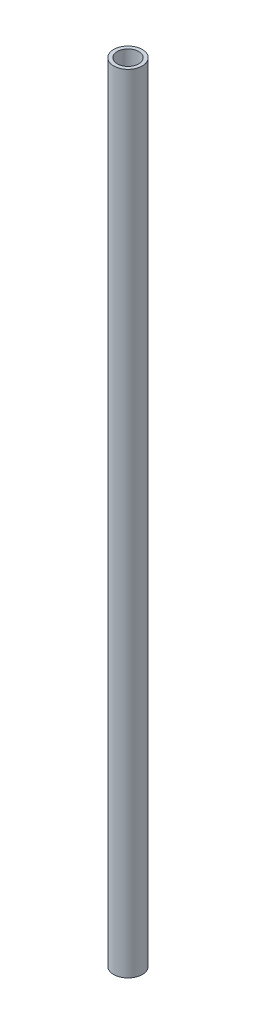
ISO-10303-21;
HEADER;
FILE_DESCRIPTION(('STEP AP214'),'2;1');
FILE_NAME('part.step','',(''),(''),'','','');
FILE_SCHEMA(('AUTOMOTIVE_DESIGN { 1 0 10303 214 1 1 1 1 }'));
ENDSEC;
DATA;
#1=APPLICATION_CONTEXT('core data for automotive mechanical design processes');
#2=APPLICATION_PROTOCOL_DEFINITION('international standard','automotive_design',2000,#1);
#3=PRODUCT_CONTEXT('',#1,'mechanical');
#4=PRODUCT('Part','Part','',(#3));
#5=PRODUCT_RELATED_PRODUCT_CATEGORY('part','',(#4));
#6=PRODUCT_DEFINITION_FORMATION('','',#4);
#7=PRODUCT_DEFINITION_CONTEXT('part definition',#1,'design');
#8=PRODUCT_DEFINITION('design','',#6,#7);
#9=PRODUCT_DEFINITION_SHAPE('','',#8);
#10=(LENGTH_UNIT() NAMED_UNIT(*) SI_UNIT(.MILLI.,.METRE.));
#11=(NAMED_UNIT(*) PLANE_ANGLE_UNIT() SI_UNIT($,.RADIAN.));
#12=(NAMED_UNIT(*) SI_UNIT($,.STERADIAN.) SOLID_ANGLE_UNIT());
#13=UNCERTAINTY_MEASURE_WITH_UNIT(LENGTH_MEASURE(1.E-05),#10,'distance_accuracy_value','');
#14=(GEOMETRIC_REPRESENTATION_CONTEXT(3) GLOBAL_UNCERTAINTY_ASSIGNED_CONTEXT((#13)) GLOBAL_UNIT_ASSIGNED_CONTEXT((#10,
#11,#12)) REPRESENTATION_CONTEXT('',''));
#15=CARTESIAN_POINT('',(0.,0.,0.));
#16=DIRECTION('',(0.,0.,1.));
#17=DIRECTION('',(1.,0.,0.));
#18=AXIS2_PLACEMENT_3D('',#15,#16,#17);
#19=CARTESIAN_POINT('',(0.,0.,0.));
#20=DIRECTION('',(0.,1.,0.));
#21=DIRECTION('',(0.,0.,1.));
#22=AXIS2_PLACEMENT_3D('',#19,#20,#21);
#23=CYLINDRICAL_SURFACE('',#22,4.);
#24=CARTESIAN_POINT('',(0.,220.,0.));
#25=DIRECTION('',(0.,1.,0.));
#26=DIRECTION('',(0.,0.,1.));
#27=AXIS2_PLACEMENT_3D('',#24,#25,#26);
#28=CIRCLE('',#27,4.);
#29=CARTESIAN_POINT('',(0.,220.,4.));
#30=VERTEX_POINT('',#29);
#31=EDGE_CURVE('E62',#30,#30,#28,.T.);
#32=ORIENTED_EDGE('',*,*,#31,.F.);
#33=EDGE_LOOP('',(#32));
#34=FACE_BOUND('',#33,.T.);
#35=CARTESIAN_POINT('',(0.,0.,0.));
#36=DIRECTION('',(0.,1.,0.));
#37=DIRECTION('',(0.,0.,1.));
#38=AXIS2_PLACEMENT_3D('',#35,#36,#37);
#39=CIRCLE('',#38,4.);
#40=CARTESIAN_POINT('',(0.,0.,4.));
#41=VERTEX_POINT('',#40);
#42=EDGE_CURVE('E47',#41,#41,#39,.T.);
#43=ORIENTED_EDGE('',*,*,#42,.T.);
#44=EDGE_LOOP('',(#43));
#45=FACE_BOUND('',#44,.T.);
#46=ADVANCED_FACE('F44',(#34,#45),#23,.T.);
#47=CARTESIAN_POINT('',(0.,0.,0.));
#48=DIRECTION('',(0.,1.,0.));
#49=DIRECTION('',(0.,0.,1.));
#50=AXIS2_PLACEMENT_3D('',#47,#48,#49);
#51=PLANE('',#50);
#52=CARTESIAN_POINT('',(0.,0.,0.));
#53=DIRECTION('',(0.,1.,0.));
#54=DIRECTION('',(0.,0.,1.));
#55=AXIS2_PLACEMENT_3D('',#52,#53,#54);
#56=CIRCLE('',#55,3.);
#57=CARTESIAN_POINT('',(0.,0.,3.));
#58=VERTEX_POINT('',#57);
#59=EDGE_CURVE('E52',#58,#58,#56,.F.);
#60=ORIENTED_EDGE('',*,*,#59,.F.);
#61=EDGE_LOOP('',(#60));
#62=FACE_BOUND('',#61,.T.);
#63=ORIENTED_EDGE('',*,*,#42,.F.);
#64=EDGE_LOOP('',(#63));
#65=FACE_BOUND('',#64,.T.);
#66=ADVANCED_FACE('F80',(#62,#65),#51,.F.);
#67=CARTESIAN_POINT('',(0.,220.,0.));
#68=DIRECTION('',(0.,1.,0.));
#69=DIRECTION('',(0.,0.,1.));
#70=AXIS2_PLACEMENT_3D('',#67,#68,#69);
#71=PLANE('',#70);
#72=CARTESIAN_POINT('',(0.,220.,0.));
#73=DIRECTION('',(0.,1.,0.));
#74=DIRECTION('',(0.,0.,1.));
#75=AXIS2_PLACEMENT_3D('',#72,#73,#74);
#76=CIRCLE('',#75,3.);
#77=CARTESIAN_POINT('',(0.,220.,3.));
#78=VERTEX_POINT('',#77);
#79=EDGE_CURVE('E13',#78,#78,#76,.F.);
#80=ORIENTED_EDGE('',*,*,#79,.T.);
#81=EDGE_LOOP('',(#80));
#82=FACE_BOUND('',#81,.T.);
#83=ORIENTED_EDGE('',*,*,#31,.T.);
#84=EDGE_LOOP('',(#83));
#85=FACE_BOUND('',#84,.T.);
#86=ADVANCED_FACE('F69',(#82,#85),#71,.T.);
#87=CARTESIAN_POINT('',(0.,0.,0.));
#88=DIRECTION('',(0.,1.,0.));
#89=DIRECTION('',(0.,0.,1.));
#90=AXIS2_PLACEMENT_3D('',#87,#88,#89);
#91=CYLINDRICAL_SURFACE('',#90,3.);
#92=ORIENTED_EDGE('',*,*,#79,.F.);
#93=EDGE_LOOP('',(#92));
#94=FACE_BOUND('',#93,.T.);
#95=ORIENTED_EDGE('',*,*,#59,.T.);
#96=EDGE_LOOP('',(#95));
#97=FACE_BOUND('',#96,.T.);
#98=ADVANCED_FACE('F72',(#94,#97),#91,.F.);
#99=CLOSED_SHELL('',(#46,#66,#86,#98));
#100=MANIFOLD_SOLID_BREP('B2',#99);
#101=ADVANCED_BREP_SHAPE_REPRESENTATION('',(#18,#100),#14);
#102=SHAPE_DEFINITION_REPRESENTATION(#9,#101);
ENDSEC;
END-ISO-10303-21;
